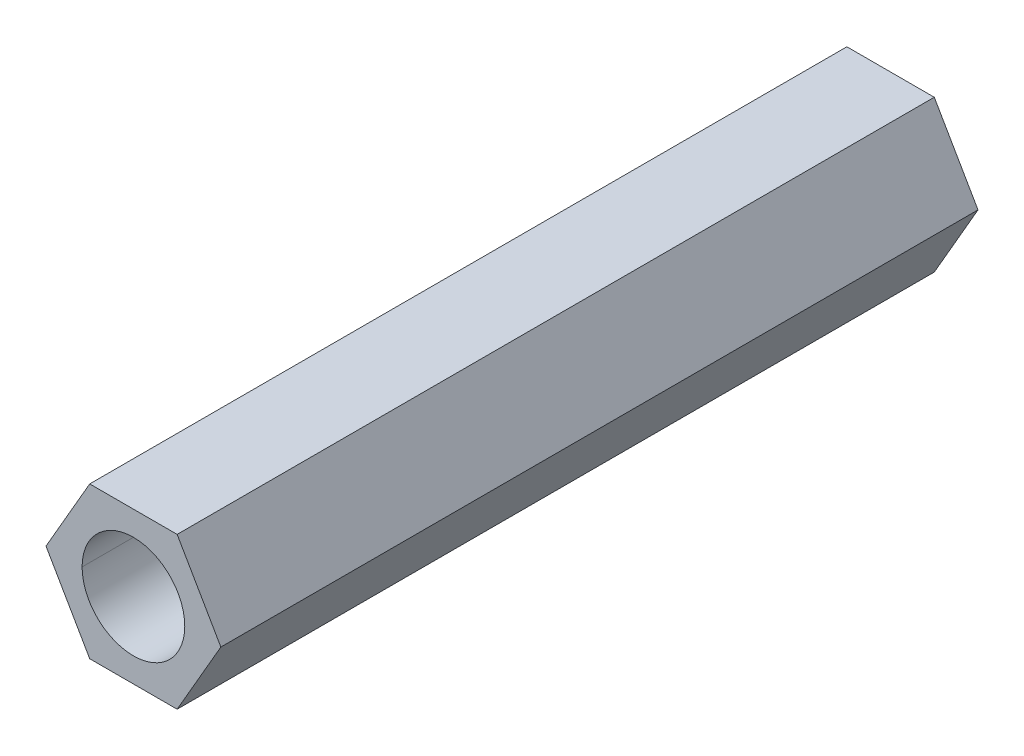
ISO-10303-21;
HEADER;
FILE_DESCRIPTION(('STEP AP214'),'2;1');
FILE_NAME('part.step','',(''),(''),'','','');
FILE_SCHEMA(('AUTOMOTIVE_DESIGN { 1 0 10303 214 1 1 1 1 }'));
ENDSEC;
DATA;
#1=APPLICATION_CONTEXT('core data for automotive mechanical design processes');
#2=APPLICATION_PROTOCOL_DEFINITION('international standard','automotive_design',2000,#1);
#3=PRODUCT_CONTEXT('',#1,'mechanical');
#4=PRODUCT('Part','Part','',(#3));
#5=PRODUCT_RELATED_PRODUCT_CATEGORY('part','',(#4));
#6=PRODUCT_DEFINITION_FORMATION('','',#4);
#7=PRODUCT_DEFINITION_CONTEXT('part definition',#1,'design');
#8=PRODUCT_DEFINITION('design','',#6,#7);
#9=PRODUCT_DEFINITION_SHAPE('','',#8);
#10=(LENGTH_UNIT() NAMED_UNIT(*) SI_UNIT(.MILLI.,.METRE.));
#11=(NAMED_UNIT(*) PLANE_ANGLE_UNIT() SI_UNIT($,.RADIAN.));
#12=(NAMED_UNIT(*) SI_UNIT($,.STERADIAN.) SOLID_ANGLE_UNIT());
#13=UNCERTAINTY_MEASURE_WITH_UNIT(LENGTH_MEASURE(1.E-05),#10,'distance_accuracy_value','');
#14=(GEOMETRIC_REPRESENTATION_CONTEXT(3) GLOBAL_UNCERTAINTY_ASSIGNED_CONTEXT((#13)) GLOBAL_UNIT_ASSIGNED_CONTEXT((#10,
#11,#12)) REPRESENTATION_CONTEXT('',''));
#15=CARTESIAN_POINT('',(0.,0.,0.));
#16=DIRECTION('',(0.,0.,1.));
#17=DIRECTION('',(1.,0.,0.));
#18=AXIS2_PLACEMENT_3D('',#15,#16,#17);
#19=CARTESIAN_POINT('',(0.,0.,15.875));
#20=DIRECTION('',(0.,0.,-1.));
#21=DIRECTION('',(-1.,0.,0.));
#22=AXIS2_PLACEMENT_3D('',#19,#20,#21);
#23=CYLINDRICAL_SURFACE('',#22,2.15265);
#24=CARTESIAN_POINT('',(0.,0.,15.875));
#25=DIRECTION('',(0.,0.,1.));
#26=DIRECTION('',(1.,0.,0.));
#27=AXIS2_PLACEMENT_3D('',#24,#25,#26);
#28=CIRCLE('',#27,2.15265);
#29=CARTESIAN_POINT('',(-2.15265,0.,15.875));
#30=VERTEX_POINT('',#29);
#31=CARTESIAN_POINT('',(2.15265,0.,15.875));
#32=VERTEX_POINT('',#31);
#33=EDGE_CURVE('E11',#30,#32,#28,.T.);
#34=ORIENTED_EDGE('',*,*,#33,.T.);
#35=DIRECTION('',(0.,0.,-1.));
#36=VECTOR('',#35,1.);
#37=CARTESIAN_POINT('',(2.15265,0.,15.875));
#38=LINE('',#37,#36);
#39=CARTESIAN_POINT('',(2.15265,0.,-15.875));
#40=VERTEX_POINT('',#39);
#41=EDGE_CURVE('E26',#32,#40,#38,.T.);
#42=ORIENTED_EDGE('',*,*,#41,.T.);
#43=CARTESIAN_POINT('',(0.,0.,-15.875));
#44=DIRECTION('',(0.,0.,1.));
#45=DIRECTION('',(1.,0.,0.));
#46=AXIS2_PLACEMENT_3D('',#43,#44,#45);
#47=CIRCLE('',#46,2.15265);
#48=CARTESIAN_POINT('',(-2.15265,0.,-15.875));
#49=VERTEX_POINT('',#48);
#50=EDGE_CURVE('E130',#49,#40,#47,.T.);
#51=ORIENTED_EDGE('',*,*,#50,.F.);
#52=DIRECTION('',(0.,0.,-1.));
#53=VECTOR('',#52,1.);
#54=CARTESIAN_POINT('',(-2.15265,0.,15.875));
#55=LINE('',#54,#53);
#56=EDGE_CURVE('E143',#30,#49,#55,.T.);
#57=ORIENTED_EDGE('',*,*,#56,.F.);
#58=EDGE_LOOP('',(#34,#42,#51,#57));
#59=FACE_BOUND('',#58,.T.);
#60=ADVANCED_FACE('F16',(#59),#23,.F.);
#61=CARTESIAN_POINT('',(3.66617420935412,0.,15.875));
#62=DIRECTION('',(0.,0.,1.));
#63=DIRECTION('',(1.,0.,0.));
#64=AXIS2_PLACEMENT_3D('',#61,#62,#63);
#65=PLANE('',#64);
#66=DIRECTION('',(0.5,0.866025403784439,0.));
#67=VECTOR('',#66,1.);
#68=CARTESIAN_POINT('',(1.83308710467706,-3.175,15.875));
#69=LINE('',#68,#67);
#70=CARTESIAN_POINT('',(1.83308710467706,-3.175,15.875));
#71=VERTEX_POINT('',#70);
#72=CARTESIAN_POINT('',(3.66617420935412,0.,15.875));
#73=VERTEX_POINT('',#72);
#74=EDGE_CURVE('E102',#71,#73,#69,.T.);
#75=ORIENTED_EDGE('',*,*,#74,.T.);
#76=DIRECTION('',(-0.5,0.866025403784439,0.));
#77=VECTOR('',#76,1.);
#78=CARTESIAN_POINT('',(3.66617420935412,0.,15.875));
#79=LINE('',#78,#77);
#80=CARTESIAN_POINT('',(1.83308710467705,3.175,15.875));
#81=VERTEX_POINT('',#80);
#82=EDGE_CURVE('E95',#73,#81,#79,.T.);
#83=ORIENTED_EDGE('',*,*,#82,.T.);
#84=DIRECTION('',(-1.,0.,0.));
#85=VECTOR('',#84,1.);
#86=CARTESIAN_POINT('',(1.83308710467705,3.175,15.875));
#87=LINE('',#86,#85);
#88=CARTESIAN_POINT('',(-1.83308710467706,3.175,15.875));
#89=VERTEX_POINT('',#88);
#90=EDGE_CURVE('E84',#81,#89,#87,.T.);
#91=ORIENTED_EDGE('',*,*,#90,.T.);
#92=DIRECTION('',(-0.5,-0.866025403784439,0.));
#93=VECTOR('',#92,1.);
#94=CARTESIAN_POINT('',(-1.83308710467706,3.175,15.875));
#95=LINE('',#94,#93);
#96=CARTESIAN_POINT('',(-3.66617420935413,0.,15.875));
#97=VERTEX_POINT('',#96);
#98=EDGE_CURVE('E96',#89,#97,#95,.T.);
#99=ORIENTED_EDGE('',*,*,#98,.T.);
#100=DIRECTION('',(0.5,-0.866025403784439,0.));
#101=VECTOR('',#100,1.);
#102=CARTESIAN_POINT('',(-3.66617420935413,0.,15.875));
#103=LINE('',#102,#101);
#104=CARTESIAN_POINT('',(-1.83308710467707,-3.175,15.875));
#105=VERTEX_POINT('',#104);
#106=EDGE_CURVE('E162',#97,#105,#103,.T.);
#107=ORIENTED_EDGE('',*,*,#106,.T.);
#108=DIRECTION('',(1.,0.,0.));
#109=VECTOR('',#108,1.);
#110=CARTESIAN_POINT('',(-1.83308710467707,-3.175,15.875));
#111=LINE('',#110,#109);
#112=EDGE_CURVE('E155',#105,#71,#111,.T.);
#113=ORIENTED_EDGE('',*,*,#112,.T.);
#114=EDGE_LOOP('',(#75,#83,#91,#99,#107,#113));
#115=FACE_BOUND('',#114,.T.);
#116=ORIENTED_EDGE('',*,*,#33,.F.);
#117=CARTESIAN_POINT('',(0.,0.,15.875));
#118=DIRECTION('',(0.,0.,1.));
#119=DIRECTION('',(1.,0.,0.));
#120=AXIS2_PLACEMENT_3D('',#117,#118,#119);
#121=CIRCLE('',#120,2.15265);
#122=EDGE_CURVE('E141',#32,#30,#121,.T.);
#123=ORIENTED_EDGE('',*,*,#122,.F.);
#124=EDGE_LOOP('',(#116,#123));
#125=FACE_BOUND('',#124,.T.);
#126=ADVANCED_FACE('F99',(#115,#125),#65,.T.);
#127=CARTESIAN_POINT('',(3.66617420935412,0.,-15.875));
#128=DIRECTION('',(0.,0.,1.));
#129=DIRECTION('',(1.,0.,0.));
#130=AXIS2_PLACEMENT_3D('',#127,#128,#129);
#131=PLANE('',#130);
#132=DIRECTION('',(0.5,0.866025403784439,0.));
#133=VECTOR('',#132,1.);
#134=CARTESIAN_POINT('',(1.83308710467706,-3.175,-15.875));
#135=LINE('',#134,#133);
#136=CARTESIAN_POINT('',(1.83308710467706,-3.175,-15.875));
#137=VERTEX_POINT('',#136);
#138=CARTESIAN_POINT('',(3.66617420935412,0.,-15.875));
#139=VERTEX_POINT('',#138);
#140=EDGE_CURVE('E131',#137,#139,#135,.T.);
#141=ORIENTED_EDGE('',*,*,#140,.F.);
#142=DIRECTION('',(1.,0.,0.));
#143=VECTOR('',#142,1.);
#144=CARTESIAN_POINT('',(-1.83308710467707,-3.175,-15.875));
#145=LINE('',#144,#143);
#146=CARTESIAN_POINT('',(-1.83308710467707,-3.175,-15.875));
#147=VERTEX_POINT('',#146);
#148=EDGE_CURVE('E140',#147,#137,#145,.T.);
#149=ORIENTED_EDGE('',*,*,#148,.F.);
#150=DIRECTION('',(0.5,-0.866025403784439,0.));
#151=VECTOR('',#150,1.);
#152=CARTESIAN_POINT('',(-3.66617420935413,0.,-15.875));
#153=LINE('',#152,#151);
#154=CARTESIAN_POINT('',(-3.66617420935413,0.,-15.875));
#155=VERTEX_POINT('',#154);
#156=EDGE_CURVE('E145',#155,#147,#153,.T.);
#157=ORIENTED_EDGE('',*,*,#156,.F.);
#158=DIRECTION('',(-0.5,-0.866025403784439,0.));
#159=VECTOR('',#158,1.);
#160=CARTESIAN_POINT('',(-1.83308710467706,3.175,-15.875));
#161=LINE('',#160,#159);
#162=CARTESIAN_POINT('',(-1.83308710467706,3.175,-15.875));
#163=VERTEX_POINT('',#162);
#164=EDGE_CURVE('E113',#163,#155,#161,.T.);
#165=ORIENTED_EDGE('',*,*,#164,.F.);
#166=DIRECTION('',(-1.,0.,0.));
#167=VECTOR('',#166,1.);
#168=CARTESIAN_POINT('',(1.83308710467705,3.175,-15.875));
#169=LINE('',#168,#167);
#170=CARTESIAN_POINT('',(1.83308710467705,3.175,-15.875));
#171=VERTEX_POINT('',#170);
#172=EDGE_CURVE('E112',#171,#163,#169,.T.);
#173=ORIENTED_EDGE('',*,*,#172,.F.);
#174=DIRECTION('',(-0.5,0.866025403784439,0.));
#175=VECTOR('',#174,1.);
#176=CARTESIAN_POINT('',(3.66617420935412,0.,-15.875));
#177=LINE('',#176,#175);
#178=EDGE_CURVE('E19',#139,#171,#177,.T.);
#179=ORIENTED_EDGE('',*,*,#178,.F.);
#180=EDGE_LOOP('',(#141,#149,#157,#165,#173,#179));
#181=FACE_BOUND('',#180,.T.);
#182=ORIENTED_EDGE('',*,*,#50,.T.);
#183=CARTESIAN_POINT('',(0.,0.,-15.875));
#184=DIRECTION('',(0.,0.,1.));
#185=DIRECTION('',(1.,0.,0.));
#186=AXIS2_PLACEMENT_3D('',#183,#184,#185);
#187=CIRCLE('',#186,2.15265);
#188=EDGE_CURVE('E126',#40,#49,#187,.T.);
#189=ORIENTED_EDGE('',*,*,#188,.T.);
#190=EDGE_LOOP('',(#182,#189));
#191=FACE_BOUND('',#190,.T.);
#192=ADVANCED_FACE('F199',(#181,#191),#131,.F.);
#193=CARTESIAN_POINT('',(1.83308710467706,-3.175,15.875));
#194=DIRECTION('',(-0.866025403784439,0.5,0.));
#195=DIRECTION('',(0.,0.,1.));
#196=AXIS2_PLACEMENT_3D('',#193,#194,#195);
#197=PLANE('',#196);
#198=ORIENTED_EDGE('',*,*,#140,.T.);
#199=DIRECTION('',(0.,0.,-1.));
#200=VECTOR('',#199,1.);
#201=CARTESIAN_POINT('',(3.66617420935412,0.,15.875));
#202=LINE('',#201,#200);
#203=EDGE_CURVE('E119',#73,#139,#202,.T.);
#204=ORIENTED_EDGE('',*,*,#203,.F.);
#205=ORIENTED_EDGE('',*,*,#74,.F.);
#206=DIRECTION('',(0.,0.,-1.));
#207=VECTOR('',#206,1.);
#208=CARTESIAN_POINT('',(1.83308710467706,-3.175,15.875));
#209=LINE('',#208,#207);
#210=EDGE_CURVE('E135',#71,#137,#209,.T.);
#211=ORIENTED_EDGE('',*,*,#210,.T.);
#212=EDGE_LOOP('',(#198,#204,#205,#211));
#213=FACE_BOUND('',#212,.T.);
#214=ADVANCED_FACE('F222',(#213),#197,.F.);
#215=CARTESIAN_POINT('',(3.66617420935412,0.,15.875));
#216=DIRECTION('',(-0.866025403784439,-0.5,0.));
#217=DIRECTION('',(-0.5,0.866025403784439,0.));
#218=AXIS2_PLACEMENT_3D('',#215,#216,#217);
#219=PLANE('',#218);
#220=ORIENTED_EDGE('',*,*,#178,.T.);
#221=DIRECTION('',(0.,0.,-1.));
#222=VECTOR('',#221,1.);
#223=CARTESIAN_POINT('',(1.83308710467705,3.175,15.875));
#224=LINE('',#223,#222);
#225=EDGE_CURVE('E89',#81,#171,#224,.T.);
#226=ORIENTED_EDGE('',*,*,#225,.F.);
#227=ORIENTED_EDGE('',*,*,#82,.F.);
#228=ORIENTED_EDGE('',*,*,#203,.T.);
#229=EDGE_LOOP('',(#220,#226,#227,#228));
#230=FACE_BOUND('',#229,.T.);
#231=ADVANCED_FACE('F109',(#230),#219,.F.);
#232=CARTESIAN_POINT('',(1.83308710467705,3.175,15.875));
#233=DIRECTION('',(0.,-1.,0.));
#234=DIRECTION('',(-1.,0.,0.));
#235=AXIS2_PLACEMENT_3D('',#232,#233,#234);
#236=PLANE('',#235);
#237=ORIENTED_EDGE('',*,*,#172,.T.);
#238=DIRECTION('',(0.,0.,-1.));
#239=VECTOR('',#238,1.);
#240=CARTESIAN_POINT('',(-1.83308710467706,3.175,15.875));
#241=LINE('',#240,#239);
#242=EDGE_CURVE('E91',#89,#163,#241,.T.);
#243=ORIENTED_EDGE('',*,*,#242,.F.);
#244=ORIENTED_EDGE('',*,*,#90,.F.);
#245=ORIENTED_EDGE('',*,*,#225,.T.);
#246=EDGE_LOOP('',(#237,#243,#244,#245));
#247=FACE_BOUND('',#246,.T.);
#248=ADVANCED_FACE('F87',(#247),#236,.F.);
#249=CARTESIAN_POINT('',(-1.83308710467706,3.175,15.875));
#250=DIRECTION('',(0.866025403784439,-0.5,0.));
#251=DIRECTION('',(0.,0.,-1.));
#252=AXIS2_PLACEMENT_3D('',#249,#250,#251);
#253=PLANE('',#252);
#254=ORIENTED_EDGE('',*,*,#164,.T.);
#255=DIRECTION('',(0.,0.,-1.));
#256=VECTOR('',#255,1.);
#257=CARTESIAN_POINT('',(-3.66617420935413,0.,15.875));
#258=LINE('',#257,#256);
#259=EDGE_CURVE('E149',#97,#155,#258,.T.);
#260=ORIENTED_EDGE('',*,*,#259,.F.);
#261=ORIENTED_EDGE('',*,*,#98,.F.);
#262=ORIENTED_EDGE('',*,*,#242,.T.);
#263=EDGE_LOOP('',(#254,#260,#261,#262));
#264=FACE_BOUND('',#263,.T.);
#265=ADVANCED_FACE('F295',(#264),#253,.F.);
#266=CARTESIAN_POINT('',(-3.66617420935413,0.,15.875));
#267=DIRECTION('',(0.866025403784439,0.5,0.));
#268=DIRECTION('',(0.,0.,-1.));
#269=AXIS2_PLACEMENT_3D('',#266,#267,#268);
#270=PLANE('',#269);
#271=ORIENTED_EDGE('',*,*,#156,.T.);
#272=DIRECTION('',(0.,0.,-1.));
#273=VECTOR('',#272,1.);
#274=CARTESIAN_POINT('',(-1.83308710467707,-3.175,15.875));
#275=LINE('',#274,#273);
#276=EDGE_CURVE('E136',#105,#147,#275,.T.);
#277=ORIENTED_EDGE('',*,*,#276,.F.);
#278=ORIENTED_EDGE('',*,*,#106,.F.);
#279=ORIENTED_EDGE('',*,*,#259,.T.);
#280=EDGE_LOOP('',(#271,#277,#278,#279));
#281=FACE_BOUND('',#280,.T.);
#282=ADVANCED_FACE('F296',(#281),#270,.F.);
#283=CARTESIAN_POINT('',(-1.83308710467707,-3.175,15.875));
#284=DIRECTION('',(0.,1.,0.));
#285=DIRECTION('',(1.,0.,0.));
#286=AXIS2_PLACEMENT_3D('',#283,#284,#285);
#287=PLANE('',#286);
#288=ORIENTED_EDGE('',*,*,#148,.T.);
#289=ORIENTED_EDGE('',*,*,#210,.F.);
#290=ORIENTED_EDGE('',*,*,#112,.F.);
#291=ORIENTED_EDGE('',*,*,#276,.T.);
#292=EDGE_LOOP('',(#288,#289,#290,#291));
#293=FACE_BOUND('',#292,.T.);
#294=ADVANCED_FACE('F218',(#293),#287,.F.);
#295=CARTESIAN_POINT('',(0.,0.,15.875));
#296=DIRECTION('',(0.,0.,-1.));
#297=DIRECTION('',(-1.,0.,0.));
#298=AXIS2_PLACEMENT_3D('',#295,#296,#297);
#299=CYLINDRICAL_SURFACE('',#298,2.15265);
#300=ORIENTED_EDGE('',*,*,#41,.F.);
#301=ORIENTED_EDGE('',*,*,#122,.T.);
#302=ORIENTED_EDGE('',*,*,#56,.T.);
#303=ORIENTED_EDGE('',*,*,#188,.F.);
#304=EDGE_LOOP('',(#300,#301,#302,#303));
#305=FACE_BOUND('',#304,.T.);
#306=ADVANCED_FACE('F198',(#305),#299,.F.);
#307=CLOSED_SHELL('',(#60,#126,#192,#214,#231,#248,#265,#282,#294,#306));
#308=MANIFOLD_SOLID_BREP('B1',#307);
#309=ADVANCED_BREP_SHAPE_REPRESENTATION('',(#18,#308),#14);
#310=SHAPE_DEFINITION_REPRESENTATION(#9,#309);
ENDSEC;
END-ISO-10303-21;
